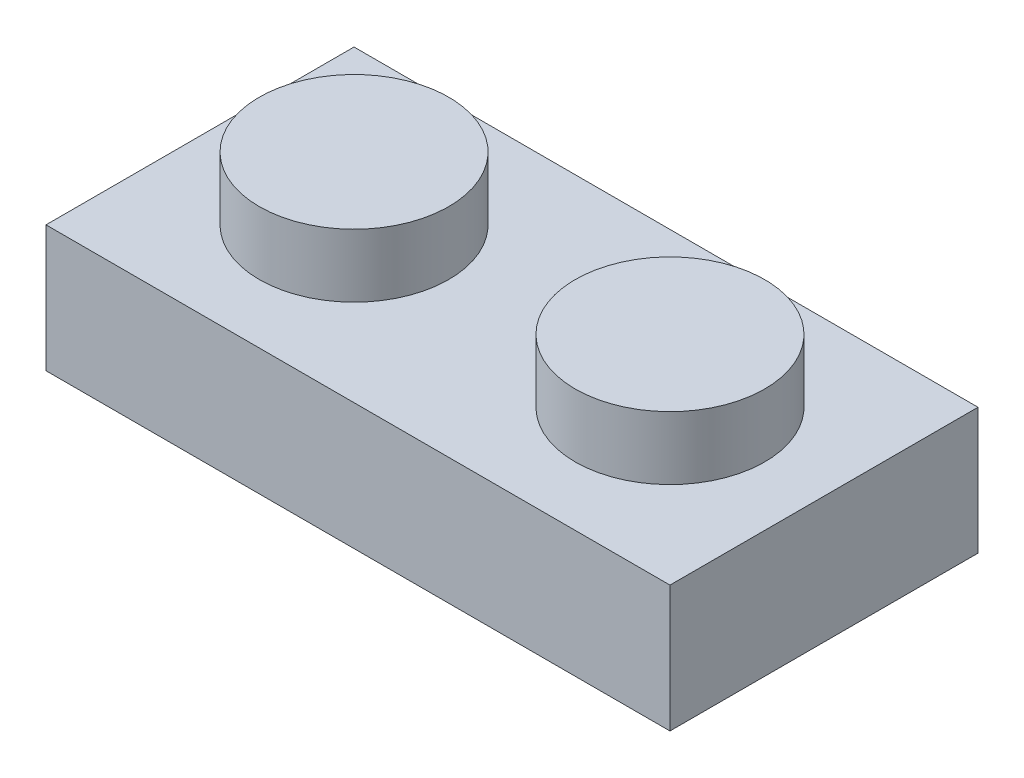
ISO-10303-21;
HEADER;
FILE_DESCRIPTION(('STEP AP214'),'2;1');
FILE_NAME('part.step','',(''),(''),'','','');
FILE_SCHEMA(('AUTOMOTIVE_DESIGN { 1 0 10303 214 1 1 1 1 }'));
ENDSEC;
DATA;
#1=APPLICATION_CONTEXT('core data for automotive mechanical design processes');
#2=APPLICATION_PROTOCOL_DEFINITION('international standard','automotive_design',2000,#1);
#3=PRODUCT_CONTEXT('',#1,'mechanical');
#4=PRODUCT('Part','Part','',(#3));
#5=PRODUCT_RELATED_PRODUCT_CATEGORY('part','',(#4));
#6=PRODUCT_DEFINITION_FORMATION('','',#4);
#7=PRODUCT_DEFINITION_CONTEXT('part definition',#1,'design');
#8=PRODUCT_DEFINITION('design','',#6,#7);
#9=PRODUCT_DEFINITION_SHAPE('','',#8);
#10=(LENGTH_UNIT() NAMED_UNIT(*) SI_UNIT(.MILLI.,.METRE.));
#11=(NAMED_UNIT(*) PLANE_ANGLE_UNIT() SI_UNIT($,.RADIAN.));
#12=(NAMED_UNIT(*) SI_UNIT($,.STERADIAN.) SOLID_ANGLE_UNIT());
#13=UNCERTAINTY_MEASURE_WITH_UNIT(LENGTH_MEASURE(1.E-05),#10,'distance_accuracy_value','');
#14=(GEOMETRIC_REPRESENTATION_CONTEXT(3) GLOBAL_UNCERTAINTY_ASSIGNED_CONTEXT((#13)) GLOBAL_UNIT_ASSIGNED_CONTEXT((#10,
#11,#12)) REPRESENTATION_CONTEXT('',''));
#15=CARTESIAN_POINT('',(0.,0.,0.));
#16=DIRECTION('',(0.,0.,1.));
#17=DIRECTION('',(1.,0.,0.));
#18=AXIS2_PLACEMENT_3D('',#15,#16,#17);
#19=CARTESIAN_POINT('',(0.,0.,-7.8));
#20=DIRECTION('',(0.,-1.,0.));
#21=DIRECTION('',(0.,0.,-1.));
#22=AXIS2_PLACEMENT_3D('',#19,#20,#21);
#23=PLANE('',#22);
#24=DIRECTION('',(1.,0.,0.));
#25=VECTOR('',#24,1.);
#26=CARTESIAN_POINT('',(0.,0.,0.));
#27=LINE('',#26,#25);
#28=CARTESIAN_POINT('',(0.,0.,0.));
#29=VERTEX_POINT('',#28);
#30=CARTESIAN_POINT('',(15.8,0.,0.));
#31=VERTEX_POINT('',#30);
#32=EDGE_CURVE('E181',#29,#31,#27,.T.);
#33=ORIENTED_EDGE('',*,*,#32,.F.);
#34=DIRECTION('',(0.,0.,1.));
#35=VECTOR('',#34,1.);
#36=CARTESIAN_POINT('',(0.,0.,-7.8));
#37=LINE('',#36,#35);
#38=CARTESIAN_POINT('',(0.,0.,-7.8));
#39=VERTEX_POINT('',#38);
#40=EDGE_CURVE('E87',#39,#29,#37,.T.);
#41=ORIENTED_EDGE('',*,*,#40,.F.);
#42=DIRECTION('',(1.,0.,0.));
#43=VECTOR('',#42,1.);
#44=CARTESIAN_POINT('',(0.,0.,-7.8));
#45=LINE('',#44,#43);
#46=CARTESIAN_POINT('',(15.8,0.,-7.8));
#47=VERTEX_POINT('',#46);
#48=EDGE_CURVE('E171',#39,#47,#45,.T.);
#49=ORIENTED_EDGE('',*,*,#48,.T.);
#50=DIRECTION('',(0.,0.,1.));
#51=VECTOR('',#50,1.);
#52=CARTESIAN_POINT('',(15.8,0.,-7.8));
#53=LINE('',#52,#51);
#54=EDGE_CURVE('E192',#47,#31,#53,.T.);
#55=ORIENTED_EDGE('',*,*,#54,.T.);
#56=EDGE_LOOP('',(#33,#41,#49,#55));
#57=FACE_BOUND('',#56,.T.);
#58=DIRECTION('',(0.,0.,1.));
#59=VECTOR('',#58,1.);
#60=CARTESIAN_POINT('',(1.2,0.,-7.8));
#61=LINE('',#60,#59);
#62=CARTESIAN_POINT('',(1.2,0.,-6.6));
#63=VERTEX_POINT('',#62);
#64=CARTESIAN_POINT('',(1.2,0.,-1.2));
#65=VERTEX_POINT('',#64);
#66=EDGE_CURVE('E129',#63,#65,#61,.T.);
#67=ORIENTED_EDGE('',*,*,#66,.T.);
#68=DIRECTION('',(1.,0.,0.));
#69=VECTOR('',#68,1.);
#70=CARTESIAN_POINT('',(0.,0.,-1.2));
#71=LINE('',#70,#69);
#72=CARTESIAN_POINT('',(14.6,0.,-1.2));
#73=VERTEX_POINT('',#72);
#74=EDGE_CURVE('E142',#65,#73,#71,.T.);
#75=ORIENTED_EDGE('',*,*,#74,.T.);
#76=DIRECTION('',(0.,0.,1.));
#77=VECTOR('',#76,1.);
#78=CARTESIAN_POINT('',(14.6,0.,-7.8));
#79=LINE('',#78,#77);
#80=CARTESIAN_POINT('',(14.6,0.,-6.6));
#81=VERTEX_POINT('',#80);
#82=EDGE_CURVE('E134',#81,#73,#79,.T.);
#83=ORIENTED_EDGE('',*,*,#82,.F.);
#84=DIRECTION('',(1.,0.,0.));
#85=VECTOR('',#84,1.);
#86=CARTESIAN_POINT('',(0.,0.,-6.6));
#87=LINE('',#86,#85);
#88=EDGE_CURVE('E53',#63,#81,#87,.T.);
#89=ORIENTED_EDGE('',*,*,#88,.F.);
#90=EDGE_LOOP('',(#67,#75,#83,#89));
#91=FACE_BOUND('',#90,.T.);
#92=ADVANCED_FACE('F38',(#57,#91),#23,.T.);
#93=CARTESIAN_POINT('',(0.,0.,-7.8));
#94=DIRECTION('',(-1.,0.,0.));
#95=DIRECTION('',(0.,0.,1.));
#96=AXIS2_PLACEMENT_3D('',#93,#94,#95);
#97=PLANE('',#96);
#98=DIRECTION('',(0.,-1.,0.));
#99=VECTOR('',#98,1.);
#100=CARTESIAN_POINT('',(0.,0.,0.));
#101=LINE('',#100,#99);
#102=CARTESIAN_POINT('',(0.,3.2,0.));
#103=VERTEX_POINT('',#102);
#104=EDGE_CURVE('E166',#103,#29,#101,.T.);
#105=ORIENTED_EDGE('',*,*,#104,.F.);
#106=DIRECTION('',(0.,0.,1.));
#107=VECTOR('',#106,1.);
#108=CARTESIAN_POINT('',(0.,3.2,-7.8));
#109=LINE('',#108,#107);
#110=CARTESIAN_POINT('',(0.,3.2,-7.8));
#111=VERTEX_POINT('',#110);
#112=EDGE_CURVE('E46',#111,#103,#109,.T.);
#113=ORIENTED_EDGE('',*,*,#112,.F.);
#114=DIRECTION('',(0.,-1.,0.));
#115=VECTOR('',#114,1.);
#116=CARTESIAN_POINT('',(0.,0.,-7.8));
#117=LINE('',#116,#115);
#118=EDGE_CURVE('E169',#111,#39,#117,.T.);
#119=ORIENTED_EDGE('',*,*,#118,.T.);
#120=ORIENTED_EDGE('',*,*,#40,.T.);
#121=EDGE_LOOP('',(#105,#113,#119,#120));
#122=FACE_BOUND('',#121,.T.);
#123=ADVANCED_FACE('F40',(#122),#97,.T.);
#124=CARTESIAN_POINT('',(0.,3.2,-7.8));
#125=DIRECTION('',(0.,1.,0.));
#126=DIRECTION('',(0.,0.,1.));
#127=AXIS2_PLACEMENT_3D('',#124,#125,#126);
#128=PLANE('',#127);
#129=CARTESIAN_POINT('',(11.9,3.2,-3.9));
#130=DIRECTION('',(0.,1.,0.));
#131=DIRECTION('',(0.,0.,1.));
#132=AXIS2_PLACEMENT_3D('',#129,#130,#131);
#133=CIRCLE('',#132,2.4);
#134=CARTESIAN_POINT('',(11.9,3.2,-1.5));
#135=VERTEX_POINT('',#134);
#136=EDGE_CURVE('E123',#135,#135,#133,.T.);
#137=ORIENTED_EDGE('',*,*,#136,.F.);
#138=EDGE_LOOP('',(#137));
#139=FACE_BOUND('',#138,.T.);
#140=CARTESIAN_POINT('',(3.9,3.2,-3.9));
#141=DIRECTION('',(0.,1.,0.));
#142=DIRECTION('',(0.,0.,1.));
#143=AXIS2_PLACEMENT_3D('',#140,#141,#142);
#144=CIRCLE('',#143,2.4);
#145=CARTESIAN_POINT('',(3.9,3.2,-1.5));
#146=VERTEX_POINT('',#145);
#147=EDGE_CURVE('E162',#146,#146,#144,.T.);
#148=ORIENTED_EDGE('',*,*,#147,.F.);
#149=EDGE_LOOP('',(#148));
#150=FACE_BOUND('',#149,.T.);
#151=DIRECTION('',(-1.,0.,0.));
#152=VECTOR('',#151,1.);
#153=CARTESIAN_POINT('',(0.,3.2,0.));
#154=LINE('',#153,#152);
#155=CARTESIAN_POINT('',(15.8,3.2,0.));
#156=VERTEX_POINT('',#155);
#157=EDGE_CURVE('E172',#156,#103,#154,.T.);
#158=ORIENTED_EDGE('',*,*,#157,.F.);
#159=DIRECTION('',(0.,0.,1.));
#160=VECTOR('',#159,1.);
#161=CARTESIAN_POINT('',(15.8,3.2,-7.8));
#162=LINE('',#161,#160);
#163=CARTESIAN_POINT('',(15.8,3.2,-7.8));
#164=VERTEX_POINT('',#163);
#165=EDGE_CURVE('E190',#164,#156,#162,.T.);
#166=ORIENTED_EDGE('',*,*,#165,.F.);
#167=DIRECTION('',(-1.,0.,0.));
#168=VECTOR('',#167,1.);
#169=CARTESIAN_POINT('',(0.,3.2,-7.8));
#170=LINE('',#169,#168);
#171=EDGE_CURVE('E177',#164,#111,#170,.T.);
#172=ORIENTED_EDGE('',*,*,#171,.T.);
#173=ORIENTED_EDGE('',*,*,#112,.T.);
#174=EDGE_LOOP('',(#158,#166,#172,#173));
#175=FACE_BOUND('',#174,.T.);
#176=ADVANCED_FACE('F197',(#139,#150,#175),#128,.T.);
#177=CARTESIAN_POINT('',(15.8,0.,-7.8));
#178=DIRECTION('',(1.,0.,0.));
#179=DIRECTION('',(0.,0.,-1.));
#180=AXIS2_PLACEMENT_3D('',#177,#178,#179);
#181=PLANE('',#180);
#182=DIRECTION('',(0.,1.,0.));
#183=VECTOR('',#182,1.);
#184=CARTESIAN_POINT('',(15.8,0.,0.));
#185=LINE('',#184,#183);
#186=EDGE_CURVE('E184',#31,#156,#185,.T.);
#187=ORIENTED_EDGE('',*,*,#186,.F.);
#188=ORIENTED_EDGE('',*,*,#54,.F.);
#189=DIRECTION('',(0.,1.,0.));
#190=VECTOR('',#189,1.);
#191=CARTESIAN_POINT('',(15.8,0.,-7.8));
#192=LINE('',#191,#190);
#193=EDGE_CURVE('E174',#47,#164,#192,.T.);
#194=ORIENTED_EDGE('',*,*,#193,.T.);
#195=ORIENTED_EDGE('',*,*,#165,.T.);
#196=EDGE_LOOP('',(#187,#188,#194,#195));
#197=FACE_BOUND('',#196,.T.);
#198=ADVANCED_FACE('F201',(#197),#181,.T.);
#199=CARTESIAN_POINT('',(0.,0.,-7.8));
#200=DIRECTION('',(0.,0.,-1.));
#201=DIRECTION('',(-1.,0.,0.));
#202=AXIS2_PLACEMENT_3D('',#199,#200,#201);
#203=PLANE('',#202);
#204=ORIENTED_EDGE('',*,*,#118,.F.);
#205=ORIENTED_EDGE('',*,*,#171,.F.);
#206=ORIENTED_EDGE('',*,*,#193,.F.);
#207=ORIENTED_EDGE('',*,*,#48,.F.);
#208=EDGE_LOOP('',(#204,#205,#206,#207));
#209=FACE_BOUND('',#208,.T.);
#210=ADVANCED_FACE('F203',(#209),#203,.T.);
#211=CARTESIAN_POINT('',(0.,0.,0.));
#212=DIRECTION('',(0.,0.,-1.));
#213=DIRECTION('',(-1.,0.,0.));
#214=AXIS2_PLACEMENT_3D('',#211,#212,#213);
#215=PLANE('',#214);
#216=ORIENTED_EDGE('',*,*,#104,.T.);
#217=ORIENTED_EDGE('',*,*,#32,.T.);
#218=ORIENTED_EDGE('',*,*,#186,.T.);
#219=ORIENTED_EDGE('',*,*,#157,.T.);
#220=EDGE_LOOP('',(#216,#217,#218,#219));
#221=FACE_BOUND('',#220,.T.);
#222=ADVANCED_FACE('F196',(#221),#215,.F.);
#223=CARTESIAN_POINT('',(3.9,4.8,-3.9));
#224=DIRECTION('',(0.,-1.,0.));
#225=DIRECTION('',(0.,0.,-1.));
#226=AXIS2_PLACEMENT_3D('',#223,#224,#225);
#227=CYLINDRICAL_SURFACE('',#226,2.4);
#228=CARTESIAN_POINT('',(3.9,4.8,-3.9));
#229=DIRECTION('',(0.,1.,0.));
#230=DIRECTION('',(0.,0.,1.));
#231=AXIS2_PLACEMENT_3D('',#228,#229,#230);
#232=CIRCLE('',#231,2.4);
#233=CARTESIAN_POINT('',(3.9,4.8,-1.5));
#234=VERTEX_POINT('',#233);
#235=EDGE_CURVE('E163',#234,#234,#232,.T.);
#236=ORIENTED_EDGE('',*,*,#235,.F.);
#237=EDGE_LOOP('',(#236));
#238=FACE_BOUND('',#237,.T.);
#239=ORIENTED_EDGE('',*,*,#147,.T.);
#240=EDGE_LOOP('',(#239));
#241=FACE_BOUND('',#240,.T.);
#242=ADVANCED_FACE('F210',(#238,#241),#227,.T.);
#243=CARTESIAN_POINT('',(3.9,4.8,-3.9));
#244=DIRECTION('',(0.,1.,0.));
#245=DIRECTION('',(0.,0.,1.));
#246=AXIS2_PLACEMENT_3D('',#243,#244,#245);
#247=PLANE('',#246);
#248=ORIENTED_EDGE('',*,*,#235,.T.);
#249=EDGE_LOOP('',(#248));
#250=FACE_BOUND('',#249,.T.);
#251=ADVANCED_FACE('F228',(#250),#247,.T.);
#252=CARTESIAN_POINT('',(11.9,4.8,-3.9));
#253=DIRECTION('',(0.,-1.,0.));
#254=DIRECTION('',(0.,0.,-1.));
#255=AXIS2_PLACEMENT_3D('',#252,#253,#254);
#256=CYLINDRICAL_SURFACE('',#255,2.4);
#257=CARTESIAN_POINT('',(11.9,4.8,-3.9));
#258=DIRECTION('',(0.,1.,0.));
#259=DIRECTION('',(0.,0.,1.));
#260=AXIS2_PLACEMENT_3D('',#257,#258,#259);
#261=CIRCLE('',#260,2.4);
#262=CARTESIAN_POINT('',(11.9,4.8,-1.5));
#263=VERTEX_POINT('',#262);
#264=EDGE_CURVE('E159',#263,#263,#261,.T.);
#265=ORIENTED_EDGE('',*,*,#264,.F.);
#266=EDGE_LOOP('',(#265));
#267=FACE_BOUND('',#266,.T.);
#268=ORIENTED_EDGE('',*,*,#136,.T.);
#269=EDGE_LOOP('',(#268));
#270=FACE_BOUND('',#269,.T.);
#271=ADVANCED_FACE('F233',(#267,#270),#256,.T.);
#272=CARTESIAN_POINT('',(11.9,4.8,-3.9));
#273=DIRECTION('',(0.,1.,0.));
#274=DIRECTION('',(0.,0.,1.));
#275=AXIS2_PLACEMENT_3D('',#272,#273,#274);
#276=PLANE('',#275);
#277=ORIENTED_EDGE('',*,*,#264,.T.);
#278=EDGE_LOOP('',(#277));
#279=FACE_BOUND('',#278,.T.);
#280=ADVANCED_FACE('F240',(#279),#276,.T.);
#281=CARTESIAN_POINT('',(1.2,0.,-7.8));
#282=DIRECTION('',(-1.,0.,0.));
#283=DIRECTION('',(0.,0.,1.));
#284=AXIS2_PLACEMENT_3D('',#281,#282,#283);
#285=PLANE('',#284);
#286=DIRECTION('',(0.,-1.,0.));
#287=VECTOR('',#286,1.);
#288=CARTESIAN_POINT('',(1.2,0.,-1.2));
#289=LINE('',#288,#287);
#290=CARTESIAN_POINT('',(1.2,2.,-1.2));
#291=VERTEX_POINT('',#290);
#292=EDGE_CURVE('E147',#291,#65,#289,.T.);
#293=ORIENTED_EDGE('',*,*,#292,.T.);
#294=ORIENTED_EDGE('',*,*,#66,.F.);
#295=DIRECTION('',(0.,-1.,0.));
#296=VECTOR('',#295,1.);
#297=CARTESIAN_POINT('',(1.2,0.,-6.6));
#298=LINE('',#297,#296);
#299=CARTESIAN_POINT('',(1.2,2.,-6.6));
#300=VERTEX_POINT('',#299);
#301=EDGE_CURVE('E126',#300,#63,#298,.T.);
#302=ORIENTED_EDGE('',*,*,#301,.F.);
#303=DIRECTION('',(0.,0.,1.));
#304=VECTOR('',#303,1.);
#305=CARTESIAN_POINT('',(1.2,2.,-7.8));
#306=LINE('',#305,#304);
#307=EDGE_CURVE('E113',#300,#291,#306,.T.);
#308=ORIENTED_EDGE('',*,*,#307,.T.);
#309=EDGE_LOOP('',(#293,#294,#302,#308));
#310=FACE_BOUND('',#309,.T.);
#311=ADVANCED_FACE('F127',(#310),#285,.F.);
#312=CARTESIAN_POINT('',(0.,2.,-7.8));
#313=DIRECTION('',(0.,1.,0.));
#314=DIRECTION('',(0.,0.,1.));
#315=AXIS2_PLACEMENT_3D('',#312,#313,#314);
#316=PLANE('',#315);
#317=CARTESIAN_POINT('',(7.9,2.,-3.9));
#318=DIRECTION('',(0.,1.,0.));
#319=DIRECTION('',(0.,0.,1.));
#320=AXIS2_PLACEMENT_3D('',#317,#318,#319);
#321=CIRCLE('',#320,1.5);
#322=CARTESIAN_POINT('',(7.9,2.,-2.4));
#323=VERTEX_POINT('',#322);
#324=EDGE_CURVE('E12',#323,#323,#321,.F.);
#325=ORIENTED_EDGE('',*,*,#324,.F.);
#326=EDGE_LOOP('',(#325));
#327=FACE_BOUND('',#326,.T.);
#328=CARTESIAN_POINT('',(11.9,2.,-3.9));
#329=DIRECTION('',(0.,1.,0.));
#330=DIRECTION('',(0.,0.,1.));
#331=AXIS2_PLACEMENT_3D('',#328,#329,#330);
#332=CIRCLE('',#331,1.2);
#333=CARTESIAN_POINT('',(11.9,2.,-2.7));
#334=VERTEX_POINT('',#333);
#335=EDGE_CURVE('E151',#334,#334,#332,.T.);
#336=ORIENTED_EDGE('',*,*,#335,.T.);
#337=EDGE_LOOP('',(#336));
#338=FACE_BOUND('',#337,.T.);
#339=CARTESIAN_POINT('',(3.9,2.,-3.9));
#340=DIRECTION('',(0.,1.,0.));
#341=DIRECTION('',(0.,0.,1.));
#342=AXIS2_PLACEMENT_3D('',#339,#340,#341);
#343=CIRCLE('',#342,1.2);
#344=CARTESIAN_POINT('',(3.9,2.,-2.7));
#345=VERTEX_POINT('',#344);
#346=EDGE_CURVE('E148',#345,#345,#343,.T.);
#347=ORIENTED_EDGE('',*,*,#346,.T.);
#348=EDGE_LOOP('',(#347));
#349=FACE_BOUND('',#348,.T.);
#350=DIRECTION('',(-1.,0.,0.));
#351=VECTOR('',#350,1.);
#352=CARTESIAN_POINT('',(0.,2.,-1.2));
#353=LINE('',#352,#351);
#354=CARTESIAN_POINT('',(14.6,2.,-1.2));
#355=VERTEX_POINT('',#354);
#356=EDGE_CURVE('E119',#355,#291,#353,.T.);
#357=ORIENTED_EDGE('',*,*,#356,.T.);
#358=ORIENTED_EDGE('',*,*,#307,.F.);
#359=DIRECTION('',(-1.,0.,0.));
#360=VECTOR('',#359,1.);
#361=CARTESIAN_POINT('',(0.,2.,-6.6));
#362=LINE('',#361,#360);
#363=CARTESIAN_POINT('',(14.6,2.,-6.6));
#364=VERTEX_POINT('',#363);
#365=EDGE_CURVE('E117',#364,#300,#362,.T.);
#366=ORIENTED_EDGE('',*,*,#365,.F.);
#367=DIRECTION('',(0.,0.,1.));
#368=VECTOR('',#367,1.);
#369=CARTESIAN_POINT('',(14.6,2.,-7.8));
#370=LINE('',#369,#368);
#371=EDGE_CURVE('E124',#364,#355,#370,.T.);
#372=ORIENTED_EDGE('',*,*,#371,.T.);
#373=EDGE_LOOP('',(#357,#358,#366,#372));
#374=FACE_BOUND('',#373,.T.);
#375=ADVANCED_FACE('F115',(#327,#338,#349,#374),#316,.F.);
#376=CARTESIAN_POINT('',(14.6,0.,-7.8));
#377=DIRECTION('',(1.,0.,0.));
#378=DIRECTION('',(0.,0.,-1.));
#379=AXIS2_PLACEMENT_3D('',#376,#377,#378);
#380=PLANE('',#379);
#381=DIRECTION('',(0.,1.,0.));
#382=VECTOR('',#381,1.);
#383=CARTESIAN_POINT('',(14.6,0.,-1.2));
#384=LINE('',#383,#382);
#385=EDGE_CURVE('E140',#73,#355,#384,.T.);
#386=ORIENTED_EDGE('',*,*,#385,.T.);
#387=ORIENTED_EDGE('',*,*,#371,.F.);
#388=DIRECTION('',(0.,1.,0.));
#389=VECTOR('',#388,1.);
#390=CARTESIAN_POINT('',(14.6,0.,-6.6));
#391=LINE('',#390,#389);
#392=EDGE_CURVE('E132',#81,#364,#391,.T.);
#393=ORIENTED_EDGE('',*,*,#392,.F.);
#394=ORIENTED_EDGE('',*,*,#82,.T.);
#395=EDGE_LOOP('',(#386,#387,#393,#394));
#396=FACE_BOUND('',#395,.T.);
#397=ADVANCED_FACE('F268',(#396),#380,.F.);
#398=CARTESIAN_POINT('',(0.,0.,-6.6));
#399=DIRECTION('',(0.,0.,-1.));
#400=DIRECTION('',(-1.,0.,0.));
#401=AXIS2_PLACEMENT_3D('',#398,#399,#400);
#402=PLANE('',#401);
#403=ORIENTED_EDGE('',*,*,#301,.T.);
#404=ORIENTED_EDGE('',*,*,#88,.T.);
#405=ORIENTED_EDGE('',*,*,#392,.T.);
#406=ORIENTED_EDGE('',*,*,#365,.T.);
#407=EDGE_LOOP('',(#403,#404,#405,#406));
#408=FACE_BOUND('',#407,.T.);
#409=ADVANCED_FACE('F131',(#408),#402,.F.);
#410=CARTESIAN_POINT('',(0.,0.,-1.2));
#411=DIRECTION('',(0.,0.,-1.));
#412=DIRECTION('',(-1.,0.,0.));
#413=AXIS2_PLACEMENT_3D('',#410,#411,#412);
#414=PLANE('',#413);
#415=ORIENTED_EDGE('',*,*,#292,.F.);
#416=ORIENTED_EDGE('',*,*,#356,.F.);
#417=ORIENTED_EDGE('',*,*,#385,.F.);
#418=ORIENTED_EDGE('',*,*,#74,.F.);
#419=EDGE_LOOP('',(#415,#416,#417,#418));
#420=FACE_BOUND('',#419,.T.);
#421=ADVANCED_FACE('F261',(#420),#414,.T.);
#422=CARTESIAN_POINT('',(3.9,4.8,-3.9));
#423=DIRECTION('',(0.,-1.,0.));
#424=DIRECTION('',(0.,0.,-1.));
#425=AXIS2_PLACEMENT_3D('',#422,#423,#424);
#426=CYLINDRICAL_SURFACE('',#425,1.2);
#427=CARTESIAN_POINT('',(3.9,3.6,-3.9));
#428=DIRECTION('',(0.,1.,0.));
#429=DIRECTION('',(0.,0.,1.));
#430=AXIS2_PLACEMENT_3D('',#427,#428,#429);
#431=CIRCLE('',#430,1.2);
#432=CARTESIAN_POINT('',(3.9,3.6,-2.7));
#433=VERTEX_POINT('',#432);
#434=EDGE_CURVE('E144',#433,#433,#431,.T.);
#435=ORIENTED_EDGE('',*,*,#434,.T.);
#436=EDGE_LOOP('',(#435));
#437=FACE_BOUND('',#436,.T.);
#438=ORIENTED_EDGE('',*,*,#346,.F.);
#439=EDGE_LOOP('',(#438));
#440=FACE_BOUND('',#439,.T.);
#441=ADVANCED_FACE('F257',(#437,#440),#426,.F.);
#442=CARTESIAN_POINT('',(3.9,3.6,-3.9));
#443=DIRECTION('',(0.,1.,0.));
#444=DIRECTION('',(0.,0.,1.));
#445=AXIS2_PLACEMENT_3D('',#442,#443,#444);
#446=PLANE('',#445);
#447=ORIENTED_EDGE('',*,*,#434,.F.);
#448=EDGE_LOOP('',(#447));
#449=FACE_BOUND('',#448,.T.);
#450=ADVANCED_FACE('F253',(#449),#446,.F.);
#451=CARTESIAN_POINT('',(11.9,4.8,-3.9));
#452=DIRECTION('',(0.,-1.,0.));
#453=DIRECTION('',(0.,0.,-1.));
#454=AXIS2_PLACEMENT_3D('',#451,#452,#453);
#455=CYLINDRICAL_SURFACE('',#454,1.2);
#456=CARTESIAN_POINT('',(11.9,3.6,-3.9));
#457=DIRECTION('',(0.,1.,0.));
#458=DIRECTION('',(0.,0.,1.));
#459=AXIS2_PLACEMENT_3D('',#456,#457,#458);
#460=CIRCLE('',#459,1.2);
#461=CARTESIAN_POINT('',(11.9,3.6,-2.7));
#462=VERTEX_POINT('',#461);
#463=EDGE_CURVE('E149',#462,#462,#460,.T.);
#464=ORIENTED_EDGE('',*,*,#463,.T.);
#465=EDGE_LOOP('',(#464));
#466=FACE_BOUND('',#465,.T.);
#467=ORIENTED_EDGE('',*,*,#335,.F.);
#468=EDGE_LOOP('',(#467));
#469=FACE_BOUND('',#468,.T.);
#470=ADVANCED_FACE('F249',(#466,#469),#455,.F.);
#471=CARTESIAN_POINT('',(11.9,3.6,-3.9));
#472=DIRECTION('',(0.,1.,0.));
#473=DIRECTION('',(0.,0.,1.));
#474=AXIS2_PLACEMENT_3D('',#471,#472,#473);
#475=PLANE('',#474);
#476=ORIENTED_EDGE('',*,*,#463,.F.);
#477=EDGE_LOOP('',(#476));
#478=FACE_BOUND('',#477,.T.);
#479=ADVANCED_FACE('F245',(#478),#475,.F.);
#480=CARTESIAN_POINT('',(7.9,-4.24264068711929,-3.9));
#481=DIRECTION('',(0.,1.,0.));
#482=DIRECTION('',(0.,0.,1.));
#483=AXIS2_PLACEMENT_3D('',#480,#481,#482);
#484=CYLINDRICAL_SURFACE('',#483,1.5);
#485=ORIENTED_EDGE('',*,*,#324,.T.);
#486=EDGE_LOOP('',(#485));
#487=FACE_BOUND('',#486,.T.);
#488=CARTESIAN_POINT('',(7.9,0.2,-3.9));
#489=DIRECTION('',(0.,-1.,0.));
#490=DIRECTION('',(0.,0.,-1.));
#491=AXIS2_PLACEMENT_3D('',#488,#489,#490);
#492=CIRCLE('',#491,1.5);
#493=CARTESIAN_POINT('',(7.9,0.2,-5.4));
#494=VERTEX_POINT('',#493);
#495=EDGE_CURVE('E298',#494,#494,#492,.T.);
#496=ORIENTED_EDGE('',*,*,#495,.F.);
#497=EDGE_LOOP('',(#496));
#498=FACE_BOUND('',#497,.T.);
#499=ADVANCED_FACE('F248',(#487,#498),#484,.T.);
#500=CARTESIAN_POINT('',(7.9,-4.24264068711929,-3.9));
#501=DIRECTION('',(0.,1.,0.));
#502=DIRECTION('',(0.,0.,1.));
#503=AXIS2_PLACEMENT_3D('',#500,#501,#502);
#504=CYLINDRICAL_SURFACE('',#503,0.6);
#505=CARTESIAN_POINT('',(7.9,2.,-3.9));
#506=DIRECTION('',(0.,-1.,0.));
#507=DIRECTION('',(0.,0.,-1.));
#508=AXIS2_PLACEMENT_3D('',#505,#506,#507);
#509=CIRCLE('',#508,0.6);
#510=CARTESIAN_POINT('',(7.9,2.,-4.5));
#511=VERTEX_POINT('',#510);
#512=EDGE_CURVE('E300',#511,#511,#509,.T.);
#513=ORIENTED_EDGE('',*,*,#512,.F.);
#514=EDGE_LOOP('',(#513));
#515=FACE_BOUND('',#514,.T.);
#516=CARTESIAN_POINT('',(7.9,0.2,-3.9));
#517=DIRECTION('',(0.,-1.,0.));
#518=DIRECTION('',(0.,0.,-1.));
#519=AXIS2_PLACEMENT_3D('',#516,#517,#518);
#520=CIRCLE('',#519,0.6);
#521=CARTESIAN_POINT('',(7.9,0.2,-4.5));
#522=VERTEX_POINT('',#521);
#523=EDGE_CURVE('E295',#522,#522,#520,.T.);
#524=ORIENTED_EDGE('',*,*,#523,.T.);
#525=EDGE_LOOP('',(#524));
#526=FACE_BOUND('',#525,.T.);
#527=ADVANCED_FACE('F280',(#515,#526),#504,.F.);
#528=CARTESIAN_POINT('',(0.,0.2,-7.8));
#529=DIRECTION('',(0.,-1.,0.));
#530=DIRECTION('',(0.,0.,-1.));
#531=AXIS2_PLACEMENT_3D('',#528,#529,#530);
#532=PLANE('',#531);
#533=ORIENTED_EDGE('',*,*,#523,.F.);
#534=EDGE_LOOP('',(#533));
#535=FACE_BOUND('',#534,.T.);
#536=ORIENTED_EDGE('',*,*,#495,.T.);
#537=EDGE_LOOP('',(#536));
#538=FACE_BOUND('',#537,.T.);
#539=ADVANCED_FACE('F284',(#535,#538),#532,.T.);
#540=ORIENTED_EDGE('',*,*,#512,.T.);
#541=EDGE_LOOP('',(#540));
#542=FACE_BOUND('',#541,.T.);
#543=ADVANCED_FACE('F275',(#542),#316,.F.);
#544=CLOSED_SHELL('',(#92,#123,#176,#198,#210,#222,#242,#251,#271,#280,#311,#375,#397,#409,#421,
#441,#450,#470,#479,#499,#527,#539,#543));
#545=MANIFOLD_SOLID_BREP('B2',#544);
#546=ADVANCED_BREP_SHAPE_REPRESENTATION('',(#18,#545),#14);
#547=SHAPE_DEFINITION_REPRESENTATION(#9,#546);
ENDSEC;
END-ISO-10303-21;
